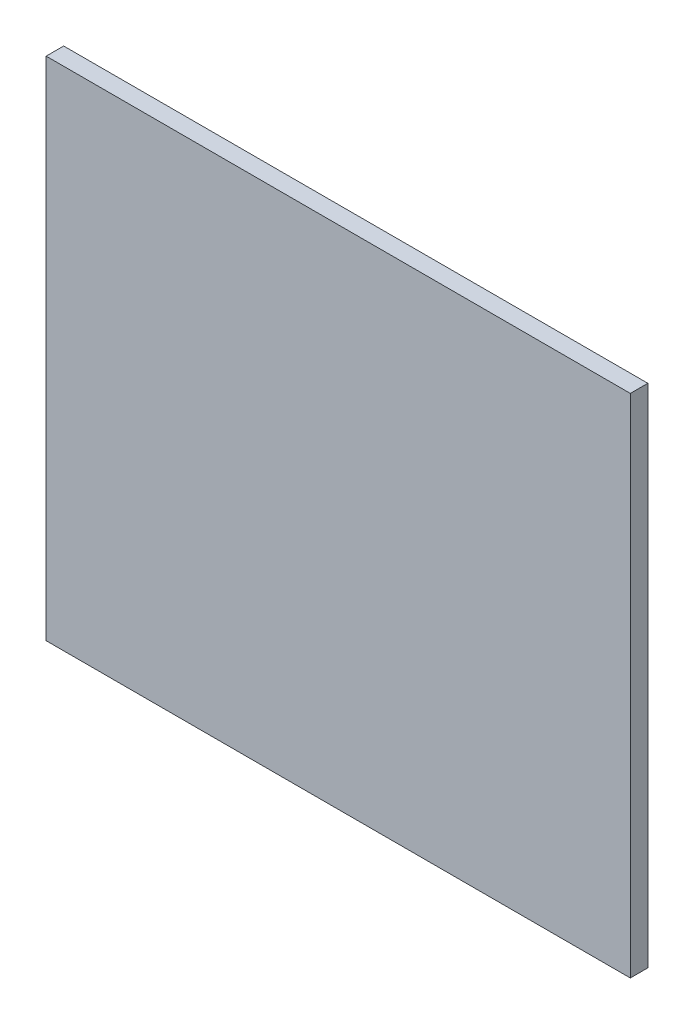
ISO-10303-21;
HEADER;
FILE_DESCRIPTION(('STEP AP214'),'2;1');
FILE_NAME('part.step','',(''),(''),'','','');
FILE_SCHEMA(('AUTOMOTIVE_DESIGN { 1 0 10303 214 1 1 1 1 }'));
ENDSEC;
DATA;
#1=APPLICATION_CONTEXT('core data for automotive mechanical design processes');
#2=APPLICATION_PROTOCOL_DEFINITION('international standard','automotive_design',2000,#1);
#3=PRODUCT_CONTEXT('',#1,'mechanical');
#4=PRODUCT('Part','Part','',(#3));
#5=PRODUCT_RELATED_PRODUCT_CATEGORY('part','',(#4));
#6=PRODUCT_DEFINITION_FORMATION('','',#4);
#7=PRODUCT_DEFINITION_CONTEXT('part definition',#1,'design');
#8=PRODUCT_DEFINITION('design','',#6,#7);
#9=PRODUCT_DEFINITION_SHAPE('','',#8);
#10=(LENGTH_UNIT() NAMED_UNIT(*) SI_UNIT(.MILLI.,.METRE.));
#11=(NAMED_UNIT(*) PLANE_ANGLE_UNIT() SI_UNIT($,.RADIAN.));
#12=(NAMED_UNIT(*) SI_UNIT($,.STERADIAN.) SOLID_ANGLE_UNIT());
#13=UNCERTAINTY_MEASURE_WITH_UNIT(LENGTH_MEASURE(1.E-05),#10,'distance_accuracy_value','');
#14=(GEOMETRIC_REPRESENTATION_CONTEXT(3) GLOBAL_UNCERTAINTY_ASSIGNED_CONTEXT((#13)) GLOBAL_UNIT_ASSIGNED_CONTEXT((#10,
#11,#12)) REPRESENTATION_CONTEXT('',''));
#15=CARTESIAN_POINT('',(0.,0.,0.));
#16=DIRECTION('',(0.,0.,1.));
#17=DIRECTION('',(1.,0.,0.));
#18=AXIS2_PLACEMENT_3D('',#15,#16,#17);
#19=CARTESIAN_POINT('',(75.,-65.,4.5));
#20=DIRECTION('',(-1.,0.,0.));
#21=DIRECTION('',(0.,-1.,0.));
#22=AXIS2_PLACEMENT_3D('',#19,#20,#21);
#23=PLANE('',#22);
#24=DIRECTION('',(0.,1.,0.));
#25=VECTOR('',#24,1.);
#26=CARTESIAN_POINT('',(75.,-65.,0.));
#27=LINE('',#26,#25);
#28=CARTESIAN_POINT('',(75.,-65.,0.));
#29=VERTEX_POINT('',#28);
#30=CARTESIAN_POINT('',(75.,65.,0.));
#31=VERTEX_POINT('',#30);
#32=EDGE_CURVE('E111',#29,#31,#27,.T.);
#33=ORIENTED_EDGE('',*,*,#32,.T.);
#34=DIRECTION('',(0.,0.,-1.));
#35=VECTOR('',#34,1.);
#36=CARTESIAN_POINT('',(75.,65.,4.5));
#37=LINE('',#36,#35);
#38=CARTESIAN_POINT('',(75.,65.,4.5));
#39=VERTEX_POINT('',#38);
#40=EDGE_CURVE('E11',#39,#31,#37,.T.);
#41=ORIENTED_EDGE('',*,*,#40,.F.);
#42=DIRECTION('',(0.,1.,0.));
#43=VECTOR('',#42,1.);
#44=CARTESIAN_POINT('',(75.,-65.,4.5));
#45=LINE('',#44,#43);
#46=CARTESIAN_POINT('',(75.,-65.,4.5));
#47=VERTEX_POINT('',#46);
#48=EDGE_CURVE('E95',#47,#39,#45,.T.);
#49=ORIENTED_EDGE('',*,*,#48,.F.);
#50=DIRECTION('',(0.,0.,-1.));
#51=VECTOR('',#50,1.);
#52=CARTESIAN_POINT('',(75.,-65.,4.5));
#53=LINE('',#52,#51);
#54=EDGE_CURVE('E107',#47,#29,#53,.T.);
#55=ORIENTED_EDGE('',*,*,#54,.T.);
#56=EDGE_LOOP('',(#33,#41,#49,#55));
#57=FACE_BOUND('',#56,.T.);
#58=ADVANCED_FACE('F43',(#57),#23,.F.);
#59=CARTESIAN_POINT('',(-75.,65.,4.5));
#60=DIRECTION('',(0.,-1.,0.));
#61=DIRECTION('',(1.,0.,0.));
#62=AXIS2_PLACEMENT_3D('',#59,#60,#61);
#63=PLANE('',#62);
#64=DIRECTION('',(-1.,0.,0.));
#65=VECTOR('',#64,1.);
#66=CARTESIAN_POINT('',(-75.,65.,0.));
#67=LINE('',#66,#65);
#68=CARTESIAN_POINT('',(-75.,65.,0.));
#69=VERTEX_POINT('',#68);
#70=EDGE_CURVE('E100',#31,#69,#67,.T.);
#71=ORIENTED_EDGE('',*,*,#70,.T.);
#72=DIRECTION('',(0.,0.,-1.));
#73=VECTOR('',#72,1.);
#74=CARTESIAN_POINT('',(-75.,65.,4.5));
#75=LINE('',#74,#73);
#76=CARTESIAN_POINT('',(-75.,65.,4.5));
#77=VERTEX_POINT('',#76);
#78=EDGE_CURVE('E52',#77,#69,#75,.T.);
#79=ORIENTED_EDGE('',*,*,#78,.F.);
#80=DIRECTION('',(-1.,0.,0.));
#81=VECTOR('',#80,1.);
#82=CARTESIAN_POINT('',(-75.,65.,4.5));
#83=LINE('',#82,#81);
#84=EDGE_CURVE('E90',#39,#77,#83,.T.);
#85=ORIENTED_EDGE('',*,*,#84,.F.);
#86=ORIENTED_EDGE('',*,*,#40,.T.);
#87=EDGE_LOOP('',(#71,#79,#85,#86));
#88=FACE_BOUND('',#87,.T.);
#89=ADVANCED_FACE('F99',(#88),#63,.F.);
#90=CARTESIAN_POINT('',(-75.,-65.,4.5));
#91=DIRECTION('',(1.,0.,0.));
#92=DIRECTION('',(0.,0.,-1.));
#93=AXIS2_PLACEMENT_3D('',#90,#91,#92);
#94=PLANE('',#93);
#95=DIRECTION('',(0.,-1.,0.));
#96=VECTOR('',#95,1.);
#97=CARTESIAN_POINT('',(-75.,-65.,0.));
#98=LINE('',#97,#96);
#99=CARTESIAN_POINT('',(-75.,-65.,0.));
#100=VERTEX_POINT('',#99);
#101=EDGE_CURVE('E77',#69,#100,#98,.T.);
#102=ORIENTED_EDGE('',*,*,#101,.T.);
#103=DIRECTION('',(0.,0.,-1.));
#104=VECTOR('',#103,1.);
#105=CARTESIAN_POINT('',(-75.,-65.,4.5));
#106=LINE('',#105,#104);
#107=CARTESIAN_POINT('',(-75.,-65.,4.5));
#108=VERTEX_POINT('',#107);
#109=EDGE_CURVE('E102',#108,#100,#106,.T.);
#110=ORIENTED_EDGE('',*,*,#109,.F.);
#111=DIRECTION('',(0.,-1.,0.));
#112=VECTOR('',#111,1.);
#113=CARTESIAN_POINT('',(-75.,-65.,4.5));
#114=LINE('',#113,#112);
#115=EDGE_CURVE('E93',#77,#108,#114,.T.);
#116=ORIENTED_EDGE('',*,*,#115,.F.);
#117=ORIENTED_EDGE('',*,*,#78,.T.);
#118=EDGE_LOOP('',(#102,#110,#116,#117));
#119=FACE_BOUND('',#118,.T.);
#120=ADVANCED_FACE('F103',(#119),#94,.F.);
#121=CARTESIAN_POINT('',(-75.,-65.,4.5));
#122=DIRECTION('',(0.,1.,0.));
#123=DIRECTION('',(0.,0.,1.));
#124=AXIS2_PLACEMENT_3D('',#121,#122,#123);
#125=PLANE('',#124);
#126=DIRECTION('',(1.,0.,0.));
#127=VECTOR('',#126,1.);
#128=CARTESIAN_POINT('',(-75.,-65.,0.));
#129=LINE('',#128,#127);
#130=EDGE_CURVE('E83',#100,#29,#129,.T.);
#131=ORIENTED_EDGE('',*,*,#130,.T.);
#132=ORIENTED_EDGE('',*,*,#54,.F.);
#133=DIRECTION('',(1.,0.,0.));
#134=VECTOR('',#133,1.);
#135=CARTESIAN_POINT('',(-75.,-65.,4.5));
#136=LINE('',#135,#134);
#137=EDGE_CURVE('E60',#108,#47,#136,.T.);
#138=ORIENTED_EDGE('',*,*,#137,.F.);
#139=ORIENTED_EDGE('',*,*,#109,.T.);
#140=EDGE_LOOP('',(#131,#132,#138,#139));
#141=FACE_BOUND('',#140,.T.);
#142=ADVANCED_FACE('F124',(#141),#125,.F.);
#143=CARTESIAN_POINT('',(0.,0.,4.5));
#144=DIRECTION('',(0.,0.,-1.));
#145=DIRECTION('',(-1.,0.,0.));
#146=AXIS2_PLACEMENT_3D('',#143,#144,#145);
#147=PLANE('',#146);
#148=ORIENTED_EDGE('',*,*,#48,.T.);
#149=ORIENTED_EDGE('',*,*,#84,.T.);
#150=ORIENTED_EDGE('',*,*,#115,.T.);
#151=ORIENTED_EDGE('',*,*,#137,.T.);
#152=EDGE_LOOP('',(#148,#149,#150,#151));
#153=FACE_BOUND('',#152,.T.);
#154=ADVANCED_FACE('F91',(#153),#147,.F.);
#155=CARTESIAN_POINT('',(0.,0.,0.));
#156=DIRECTION('',(0.,0.,-1.));
#157=DIRECTION('',(-1.,0.,0.));
#158=AXIS2_PLACEMENT_3D('',#155,#156,#157);
#159=PLANE('',#158);
#160=ORIENTED_EDGE('',*,*,#32,.F.);
#161=ORIENTED_EDGE('',*,*,#130,.F.);
#162=ORIENTED_EDGE('',*,*,#101,.F.);
#163=ORIENTED_EDGE('',*,*,#70,.F.);
#164=EDGE_LOOP('',(#160,#161,#162,#163));
#165=FACE_BOUND('',#164,.T.);
#166=ADVANCED_FACE('F127',(#165),#159,.T.);
#167=CLOSED_SHELL('',(#58,#89,#120,#142,#154,#166));
#168=MANIFOLD_SOLID_BREP('B2',#167);
#169=ADVANCED_BREP_SHAPE_REPRESENTATION('',(#18,#168),#14);
#170=SHAPE_DEFINITION_REPRESENTATION(#9,#169);
ENDSEC;
END-ISO-10303-21;
